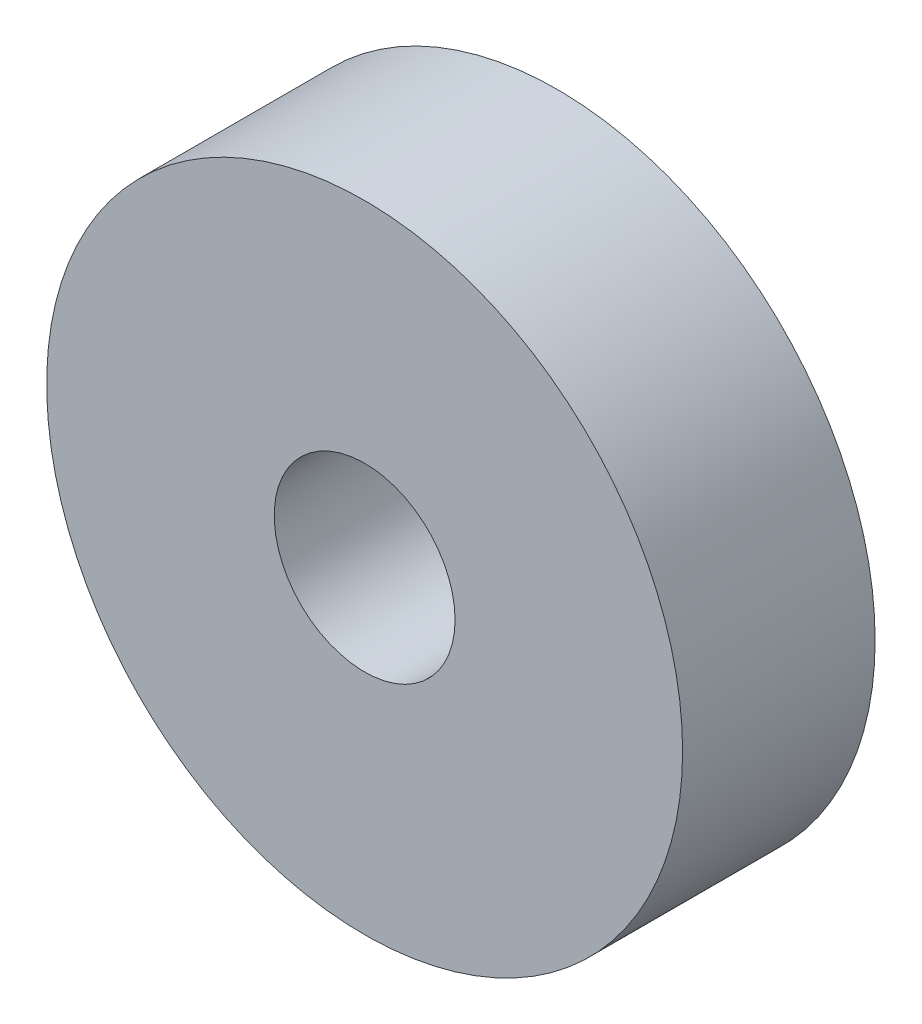
ISO-10303-21;
HEADER;
FILE_DESCRIPTION(('STEP AP214'),'2;1');
FILE_NAME('part.step','',(''),(''),'','','');
FILE_SCHEMA(('AUTOMOTIVE_DESIGN { 1 0 10303 214 1 1 1 1 }'));
ENDSEC;
DATA;
#1=APPLICATION_CONTEXT('core data for automotive mechanical design processes');
#2=APPLICATION_PROTOCOL_DEFINITION('international standard','automotive_design',2000,#1);
#3=PRODUCT_CONTEXT('',#1,'mechanical');
#4=PRODUCT('Part','Part','',(#3));
#5=PRODUCT_RELATED_PRODUCT_CATEGORY('part','',(#4));
#6=PRODUCT_DEFINITION_FORMATION('','',#4);
#7=PRODUCT_DEFINITION_CONTEXT('part definition',#1,'design');
#8=PRODUCT_DEFINITION('design','',#6,#7);
#9=PRODUCT_DEFINITION_SHAPE('','',#8);
#10=(LENGTH_UNIT() NAMED_UNIT(*) SI_UNIT(.MILLI.,.METRE.));
#11=(NAMED_UNIT(*) PLANE_ANGLE_UNIT() SI_UNIT($,.RADIAN.));
#12=(NAMED_UNIT(*) SI_UNIT($,.STERADIAN.) SOLID_ANGLE_UNIT());
#13=UNCERTAINTY_MEASURE_WITH_UNIT(LENGTH_MEASURE(1.E-05),#10,'distance_accuracy_value','');
#14=(GEOMETRIC_REPRESENTATION_CONTEXT(3) GLOBAL_UNCERTAINTY_ASSIGNED_CONTEXT((#13)) GLOBAL_UNIT_ASSIGNED_CONTEXT((#10,
#11,#12)) REPRESENTATION_CONTEXT('',''));
#15=CARTESIAN_POINT('',(0.,0.,0.));
#16=DIRECTION('',(0.,0.,1.));
#17=DIRECTION('',(1.,0.,0.));
#18=AXIS2_PLACEMENT_3D('',#15,#16,#17);
#19=CARTESIAN_POINT('',(0.,0.,6.6));
#20=DIRECTION('',(0.,0.,-1.));
#21=DIRECTION('',(-1.,0.,0.));
#22=AXIS2_PLACEMENT_3D('',#19,#20,#21);
#23=CYLINDRICAL_SURFACE('',#22,10.9);
#24=CARTESIAN_POINT('',(0.,0.,6.6));
#25=DIRECTION('',(0.,0.,1.));
#26=DIRECTION('',(1.,0.,0.));
#27=AXIS2_PLACEMENT_3D('',#24,#25,#26);
#28=CIRCLE('',#27,10.9);
#29=CARTESIAN_POINT('',(10.9,0.,6.6));
#30=VERTEX_POINT('',#29);
#31=EDGE_CURVE('E10',#30,#30,#28,.T.);
#32=ORIENTED_EDGE('',*,*,#31,.F.);
#33=EDGE_LOOP('',(#32));
#34=FACE_BOUND('',#33,.T.);
#35=CARTESIAN_POINT('',(0.,0.,0.));
#36=DIRECTION('',(0.,0.,1.));
#37=DIRECTION('',(1.,0.,0.));
#38=AXIS2_PLACEMENT_3D('',#35,#36,#37);
#39=CIRCLE('',#38,10.9);
#40=CARTESIAN_POINT('',(10.9,0.,0.));
#41=VERTEX_POINT('',#40);
#42=EDGE_CURVE('E35',#41,#41,#39,.T.);
#43=ORIENTED_EDGE('',*,*,#42,.T.);
#44=EDGE_LOOP('',(#43));
#45=FACE_BOUND('',#44,.T.);
#46=ADVANCED_FACE('F32',(#34,#45),#23,.T.);
#47=CARTESIAN_POINT('',(0.,0.,6.6));
#48=DIRECTION('',(0.,0.,1.));
#49=DIRECTION('',(1.,0.,0.));
#50=AXIS2_PLACEMENT_3D('',#47,#48,#49);
#51=PLANE('',#50);
#52=CARTESIAN_POINT('',(0.,0.,6.6));
#53=DIRECTION('',(0.,0.,1.));
#54=DIRECTION('',(1.,0.,0.));
#55=AXIS2_PLACEMENT_3D('',#52,#53,#54);
#56=CIRCLE('',#55,3.1);
#57=CARTESIAN_POINT('',(3.1,0.,6.6));
#58=VERTEX_POINT('',#57);
#59=EDGE_CURVE('E44',#58,#58,#56,.T.);
#60=ORIENTED_EDGE('',*,*,#59,.F.);
#61=EDGE_LOOP('',(#60));
#62=FACE_BOUND('',#61,.T.);
#63=ORIENTED_EDGE('',*,*,#31,.T.);
#64=EDGE_LOOP('',(#63));
#65=FACE_BOUND('',#64,.T.);
#66=ADVANCED_FACE('F59',(#62,#65),#51,.T.);
#67=CARTESIAN_POINT('',(0.,0.,0.));
#68=DIRECTION('',(0.,0.,1.));
#69=DIRECTION('',(1.,0.,0.));
#70=AXIS2_PLACEMENT_3D('',#67,#68,#69);
#71=PLANE('',#70);
#72=CARTESIAN_POINT('',(0.,0.,0.));
#73=DIRECTION('',(0.,0.,1.));
#74=DIRECTION('',(1.,0.,0.));
#75=AXIS2_PLACEMENT_3D('',#72,#73,#74);
#76=CIRCLE('',#75,3.1);
#77=CARTESIAN_POINT('',(3.1,0.,0.));
#78=VERTEX_POINT('',#77);
#79=EDGE_CURVE('E42',#78,#78,#76,.T.);
#80=ORIENTED_EDGE('',*,*,#79,.T.);
#81=EDGE_LOOP('',(#80));
#82=FACE_BOUND('',#81,.T.);
#83=ORIENTED_EDGE('',*,*,#42,.F.);
#84=EDGE_LOOP('',(#83));
#85=FACE_BOUND('',#84,.T.);
#86=ADVANCED_FACE('F50',(#82,#85),#71,.F.);
#87=CARTESIAN_POINT('',(0.,0.,0.));
#88=DIRECTION('',(0.,0.,1.));
#89=DIRECTION('',(1.,0.,0.));
#90=AXIS2_PLACEMENT_3D('',#87,#88,#89);
#91=CYLINDRICAL_SURFACE('',#90,3.1);
#92=ORIENTED_EDGE('',*,*,#79,.F.);
#93=EDGE_LOOP('',(#92));
#94=FACE_BOUND('',#93,.T.);
#95=ORIENTED_EDGE('',*,*,#59,.T.);
#96=EDGE_LOOP('',(#95));
#97=FACE_BOUND('',#96,.T.);
#98=ADVANCED_FACE('F53',(#94,#97),#91,.F.);
#99=CLOSED_SHELL('',(#46,#66,#86,#98));
#100=MANIFOLD_SOLID_BREP('B2',#99);
#101=ADVANCED_BREP_SHAPE_REPRESENTATION('',(#18,#100),#14);
#102=SHAPE_DEFINITION_REPRESENTATION(#9,#101);
ENDSEC;
END-ISO-10303-21;
